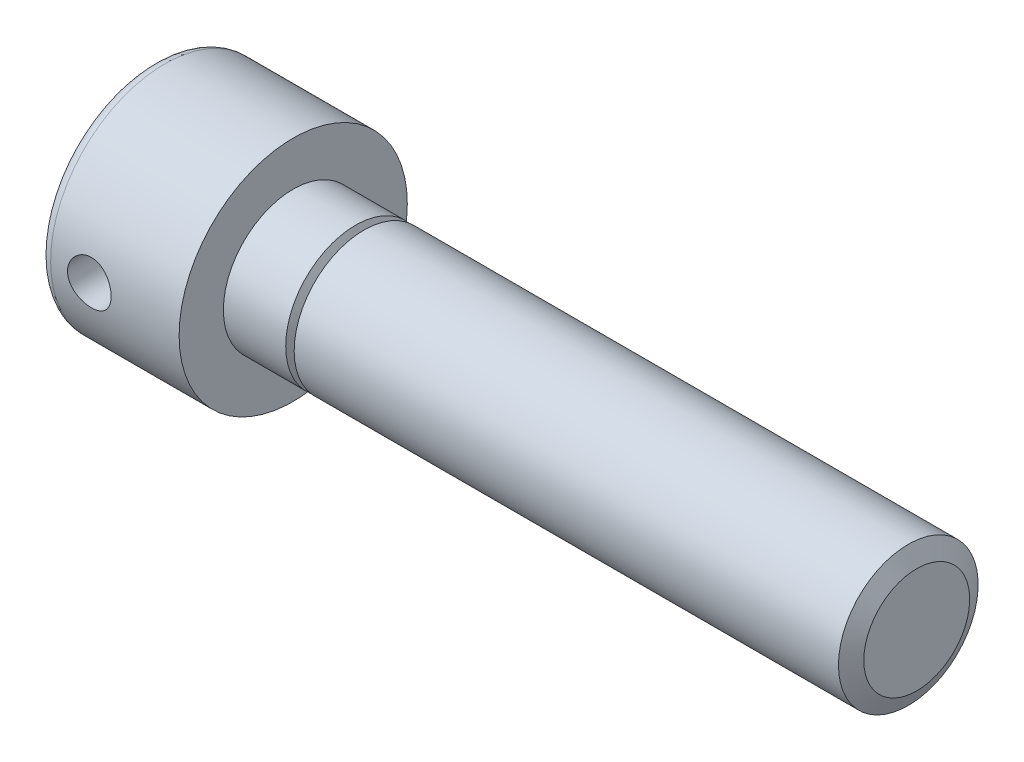
ISO-10303-21;
HEADER;
FILE_DESCRIPTION(('STEP AP214'),'2;1');
FILE_NAME('part.step','',(''),(''),'','','');
FILE_SCHEMA(('AUTOMOTIVE_DESIGN { 1 0 10303 214 1 1 1 1 }'));
ENDSEC;
DATA;
#1=APPLICATION_CONTEXT('core data for automotive mechanical design processes');
#2=APPLICATION_PROTOCOL_DEFINITION('international standard','automotive_design',2000,#1);
#3=PRODUCT_CONTEXT('',#1,'mechanical');
#4=PRODUCT('Part','Part','',(#3));
#5=PRODUCT_RELATED_PRODUCT_CATEGORY('part','',(#4));
#6=PRODUCT_DEFINITION_FORMATION('','',#4);
#7=PRODUCT_DEFINITION_CONTEXT('part definition',#1,'design');
#8=PRODUCT_DEFINITION('design','',#6,#7);
#9=PRODUCT_DEFINITION_SHAPE('','',#8);
#10=(LENGTH_UNIT() NAMED_UNIT(*) SI_UNIT(.MILLI.,.METRE.));
#11=(NAMED_UNIT(*) PLANE_ANGLE_UNIT() SI_UNIT($,.RADIAN.));
#12=(NAMED_UNIT(*) SI_UNIT($,.STERADIAN.) SOLID_ANGLE_UNIT());
#13=UNCERTAINTY_MEASURE_WITH_UNIT(LENGTH_MEASURE(1.E-05),#10,'distance_accuracy_value','');
#14=(GEOMETRIC_REPRESENTATION_CONTEXT(3) GLOBAL_UNCERTAINTY_ASSIGNED_CONTEXT((#13)) GLOBAL_UNIT_ASSIGNED_CONTEXT((#10,
#11,#12)) REPRESENTATION_CONTEXT('',''));
#15=CARTESIAN_POINT('',(0.,0.,0.));
#16=DIRECTION('',(0.,0.,1.));
#17=DIRECTION('',(1.,0.,0.));
#18=AXIS2_PLACEMENT_3D('',#15,#16,#17);
#19=CARTESIAN_POINT('',(-2.8448,0.,0.));
#20=DIRECTION('',(-1.,0.,0.));
#21=DIRECTION('',(0.,0.,1.));
#22=AXIS2_PLACEMENT_3D('',#19,#20,#21);
#23=PLANE('',#22);
#24=CARTESIAN_POINT('',(-2.8448,0.,0.));
#25=DIRECTION('',(-1.,0.,0.));
#26=DIRECTION('',(0.,0.,1.));
#27=AXIS2_PLACEMENT_3D('',#24,#25,#26);
#28=CIRCLE('',#27,2.0955);
#29=CARTESIAN_POINT('',(-2.8448,0.,2.0955));
#30=VERTEX_POINT('',#29);
#31=EDGE_CURVE('E107',#30,#30,#28,.T.);
#32=ORIENTED_EDGE('',*,*,#31,.T.);
#33=EDGE_LOOP('',(#32));
#34=FACE_BOUND('',#33,.T.);
#35=DIRECTION('',(0.,-1.,0.));
#36=VECTOR('',#35,1.);
#37=CARTESIAN_POINT('',(-2.8448,0.,1.1938));
#38=LINE('',#37,#36);
#39=CARTESIAN_POINT('',(-2.8448,0.689240751358576,1.1938));
#40=VERTEX_POINT('',#39);
#41=CARTESIAN_POINT('',(-2.8448,-0.689240751358574,1.1938));
#42=VERTEX_POINT('',#41);
#43=EDGE_CURVE('E135',#40,#42,#38,.T.);
#44=ORIENTED_EDGE('',*,*,#43,.T.);
#45=DIRECTION('',(0.,-0.5,-0.866025403784439));
#46=VECTOR('',#45,1.);
#47=CARTESIAN_POINT('',(-2.8448,-1.03386112703786,0.5969));
#48=LINE('',#47,#46);
#49=CARTESIAN_POINT('',(-2.8448,-1.37848150271715,0.));
#50=VERTEX_POINT('',#49);
#51=EDGE_CURVE('E9',#42,#50,#48,.T.);
#52=ORIENTED_EDGE('',*,*,#51,.T.);
#53=DIRECTION('',(0.,0.5,-0.866025403784439));
#54=VECTOR('',#53,1.);
#55=CARTESIAN_POINT('',(-2.8448,-1.03386112703786,-0.5969));
#56=LINE('',#55,#54);
#57=CARTESIAN_POINT('',(-2.8448,-0.689240751358576,-1.1938));
#58=VERTEX_POINT('',#57);
#59=EDGE_CURVE('E25',#50,#58,#56,.T.);
#60=ORIENTED_EDGE('',*,*,#59,.T.);
#61=DIRECTION('',(0.,1.,0.));
#62=VECTOR('',#61,1.);
#63=CARTESIAN_POINT('',(-2.8448,0.,-1.1938));
#64=LINE('',#63,#62);
#65=CARTESIAN_POINT('',(-2.8448,0.689240751358575,-1.1938));
#66=VERTEX_POINT('',#65);
#67=EDGE_CURVE('E147',#58,#66,#64,.T.);
#68=ORIENTED_EDGE('',*,*,#67,.T.);
#69=DIRECTION('',(0.,0.5,0.866025403784439));
#70=VECTOR('',#69,1.);
#71=CARTESIAN_POINT('',(-2.8448,1.03386112703786,-0.5969));
#72=LINE('',#71,#70);
#73=CARTESIAN_POINT('',(-2.8448,1.37848150271715,0.));
#74=VERTEX_POINT('',#73);
#75=EDGE_CURVE('E143',#66,#74,#72,.T.);
#76=ORIENTED_EDGE('',*,*,#75,.T.);
#77=DIRECTION('',(0.,-0.5,0.866025403784439));
#78=VECTOR('',#77,1.);
#79=CARTESIAN_POINT('',(-2.8448,1.03386112703786,0.5969));
#80=LINE('',#79,#78);
#81=EDGE_CURVE('E139',#74,#40,#80,.T.);
#82=ORIENTED_EDGE('',*,*,#81,.T.);
#83=EDGE_LOOP('',(#44,#52,#60,#68,#76,#82));
#84=FACE_BOUND('',#83,.T.);
#85=ADVANCED_FACE('F15',(#34,#84),#23,.T.);
#86=CARTESIAN_POINT('',(0.,-2.3241,0.));
#87=DIRECTION('',(1.,0.,0.));
#88=DIRECTION('',(0.,0.,-1.));
#89=AXIS2_PLACEMENT_3D('',#86,#87,#88);
#90=PLANE('',#89);
#91=CARTESIAN_POINT('',(0.,0.,0.));
#92=DIRECTION('',(-1.,0.,0.));
#93=DIRECTION('',(0.,0.,1.));
#94=AXIS2_PLACEMENT_3D('',#91,#92,#93);
#95=CIRCLE('',#94,1.4224);
#96=CARTESIAN_POINT('',(0.,0.,1.4224));
#97=VERTEX_POINT('',#96);
#98=EDGE_CURVE('E131',#97,#97,#95,.T.);
#99=ORIENTED_EDGE('',*,*,#98,.T.);
#100=EDGE_LOOP('',(#99));
#101=FACE_BOUND('',#100,.T.);
#102=CARTESIAN_POINT('',(0.,0.,0.));
#103=DIRECTION('',(-1.,0.,0.));
#104=DIRECTION('',(0.,0.,1.));
#105=AXIS2_PLACEMENT_3D('',#102,#103,#104);
#106=CIRCLE('',#105,2.3241);
#107=CARTESIAN_POINT('',(0.,0.,2.3241));
#108=VERTEX_POINT('',#107);
#109=EDGE_CURVE('E89',#108,#108,#106,.T.);
#110=ORIENTED_EDGE('',*,*,#109,.F.);
#111=EDGE_LOOP('',(#110));
#112=FACE_BOUND('',#111,.T.);
#113=ADVANCED_FACE('F17',(#101,#112),#90,.T.);
#114=CARTESIAN_POINT('',(-2.8448,0.,0.));
#115=DIRECTION('',(-1.,0.,0.));
#116=DIRECTION('',(0.,0.,1.));
#117=AXIS2_PLACEMENT_3D('',#114,#115,#116);
#118=CYLINDRICAL_SURFACE('',#117,1.4224);
#119=CARTESIAN_POINT('',(1.27,0.,0.));
#120=DIRECTION('',(-1.,0.,0.));
#121=DIRECTION('',(0.,0.,1.));
#122=AXIS2_PLACEMENT_3D('',#119,#120,#121);
#123=CIRCLE('',#122,1.4224);
#124=CARTESIAN_POINT('',(1.27,0.,1.4224));
#125=VERTEX_POINT('',#124);
#126=EDGE_CURVE('E127',#125,#125,#123,.T.);
#127=ORIENTED_EDGE('',*,*,#126,.T.);
#128=EDGE_LOOP('',(#127));
#129=FACE_BOUND('',#128,.T.);
#130=ORIENTED_EDGE('',*,*,#98,.F.);
#131=EDGE_LOOP('',(#130));
#132=FACE_BOUND('',#131,.T.);
#133=ADVANCED_FACE('F331',(#129,#132),#118,.T.);
#134=CARTESIAN_POINT('',(1.27,0.,0.));
#135=DIRECTION('',(-1.,0.,0.));
#136=DIRECTION('',(0.,0.,1.));
#137=AXIS2_PLACEMENT_3D('',#134,#135,#136);
#138=CONICAL_SURFACE('',#137,1.4224,1.10714871779409);
#139=CARTESIAN_POINT('',(1.442085,0.,0.));
#140=DIRECTION('',(-1.,0.,0.));
#141=DIRECTION('',(0.,0.,1.));
#142=AXIS2_PLACEMENT_3D('',#139,#140,#141);
#143=CIRCLE('',#142,1.07823);
#144=CARTESIAN_POINT('',(1.442085,0.,1.07823));
#145=VERTEX_POINT('',#144);
#146=EDGE_CURVE('E123',#145,#145,#143,.T.);
#147=ORIENTED_EDGE('',*,*,#146,.T.);
#148=EDGE_LOOP('',(#147));
#149=FACE_BOUND('',#148,.T.);
#150=ORIENTED_EDGE('',*,*,#126,.F.);
#151=EDGE_LOOP('',(#150));
#152=FACE_BOUND('',#151,.T.);
#153=ADVANCED_FACE('F322',(#149,#152),#138,.T.);
#154=CARTESIAN_POINT('',(1.442085,-1.07823,0.));
#155=DIRECTION('',(-1.,0.,0.));
#156=DIRECTION('',(0.,0.,1.));
#157=AXIS2_PLACEMENT_3D('',#154,#155,#156);
#158=PLANE('',#157);
#159=CARTESIAN_POINT('',(1.442085,0.,0.));
#160=DIRECTION('',(-1.,0.,0.));
#161=DIRECTION('',(0.,0.,1.));
#162=AXIS2_PLACEMENT_3D('',#159,#160,#161);
#163=CIRCLE('',#162,1.4224);
#164=CARTESIAN_POINT('',(1.442085,0.,1.4224));
#165=VERTEX_POINT('',#164);
#166=EDGE_CURVE('E119',#165,#165,#163,.T.);
#167=ORIENTED_EDGE('',*,*,#166,.T.);
#168=EDGE_LOOP('',(#167));
#169=FACE_BOUND('',#168,.T.);
#170=ORIENTED_EDGE('',*,*,#146,.F.);
#171=EDGE_LOOP('',(#170));
#172=FACE_BOUND('',#171,.T.);
#173=ADVANCED_FACE('F313',(#169,#172),#158,.T.);
#174=CARTESIAN_POINT('',(-2.8448,0.,0.));
#175=DIRECTION('',(-1.,0.,0.));
#176=DIRECTION('',(0.,0.,1.));
#177=AXIS2_PLACEMENT_3D('',#174,#175,#176);
#178=CYLINDRICAL_SURFACE('',#177,1.4224);
#179=CARTESIAN_POINT('',(12.527915,0.,0.));
#180=DIRECTION('',(-1.,0.,0.));
#181=DIRECTION('',(0.,0.,1.));
#182=AXIS2_PLACEMENT_3D('',#179,#180,#181);
#183=CIRCLE('',#182,1.4224);
#184=CARTESIAN_POINT('',(12.527915,0.,1.4224));
#185=VERTEX_POINT('',#184);
#186=EDGE_CURVE('E115',#185,#185,#183,.T.);
#187=ORIENTED_EDGE('',*,*,#186,.T.);
#188=EDGE_LOOP('',(#187));
#189=FACE_BOUND('',#188,.T.);
#190=ORIENTED_EDGE('',*,*,#166,.F.);
#191=EDGE_LOOP('',(#190));
#192=FACE_BOUND('',#191,.T.);
#193=ADVANCED_FACE('F304',(#189,#192),#178,.T.);
#194=CARTESIAN_POINT('',(12.527915,0.,0.));
#195=DIRECTION('',(-1.,0.,0.));
#196=DIRECTION('',(0.,0.,1.));
#197=AXIS2_PLACEMENT_3D('',#194,#195,#196);
#198=CONICAL_SURFACE('',#197,1.4224,1.10714871779409);
#199=CARTESIAN_POINT('',(12.7,0.,0.));
#200=DIRECTION('',(-1.,0.,0.));
#201=DIRECTION('',(0.,0.,1.));
#202=AXIS2_PLACEMENT_3D('',#199,#200,#201);
#203=CIRCLE('',#202,1.07823);
#204=CARTESIAN_POINT('',(12.7,0.,1.07823));
#205=VERTEX_POINT('',#204);
#206=EDGE_CURVE('E111',#205,#205,#203,.T.);
#207=ORIENTED_EDGE('',*,*,#206,.T.);
#208=EDGE_LOOP('',(#207));
#209=FACE_BOUND('',#208,.T.);
#210=ORIENTED_EDGE('',*,*,#186,.F.);
#211=EDGE_LOOP('',(#210));
#212=FACE_BOUND('',#211,.T.);
#213=ADVANCED_FACE('F295',(#209,#212),#198,.T.);
#214=CARTESIAN_POINT('',(12.7,-1.07823,0.));
#215=DIRECTION('',(1.,0.,0.));
#216=DIRECTION('',(0.,0.,-1.));
#217=AXIS2_PLACEMENT_3D('',#214,#215,#216);
#218=PLANE('',#217);
#219=ORIENTED_EDGE('',*,*,#206,.F.);
#220=EDGE_LOOP('',(#219));
#221=FACE_BOUND('',#220,.T.);
#222=ADVANCED_FACE('F286',(#221),#218,.T.);
#223=CARTESIAN_POINT('',(-2.6162,0.,0.));
#224=DIRECTION('',(-1.,0.,0.));
#225=DIRECTION('',(0.,0.,1.));
#226=AXIS2_PLACEMENT_3D('',#223,#224,#225);
#227=TOROIDAL_SURFACE('',#226,2.0955,0.2286);
#228=CARTESIAN_POINT('',(-2.6162,0.,0.));
#229=DIRECTION('',(-1.,0.,0.));
#230=DIRECTION('',(0.,0.,1.));
#231=AXIS2_PLACEMENT_3D('',#228,#229,#230);
#232=CIRCLE('',#231,2.3241);
#233=CARTESIAN_POINT('',(-2.6162,0.,2.3241));
#234=VERTEX_POINT('',#233);
#235=EDGE_CURVE('E97',#234,#234,#232,.T.);
#236=ORIENTED_EDGE('',*,*,#235,.T.);
#237=EDGE_LOOP('',(#236));
#238=FACE_BOUND('',#237,.T.);
#239=ORIENTED_EDGE('',*,*,#31,.F.);
#240=EDGE_LOOP('',(#239));
#241=FACE_BOUND('',#240,.T.);
#242=ADVANCED_FACE('F277',(#238,#241),#227,.T.);
#243=CARTESIAN_POINT('',(-2.8448,0.,0.));
#244=DIRECTION('',(-1.,0.,0.));
#245=DIRECTION('',(0.,0.,1.));
#246=AXIS2_PLACEMENT_3D('',#243,#244,#245);
#247=CYLINDRICAL_SURFACE('',#246,2.3241);
#248=CARTESIAN_POINT('',(-1.3843,0.,2.3241));
#249=CARTESIAN_POINT('',(-1.38430093486755,0.0247261879495477,2.32409954927227));
#250=CARTESIAN_POINT('',(-1.38637013598345,0.0494644362756174,2.32370133868878));
#251=CARTESIAN_POINT('',(-1.39458657435463,0.0982431939285799,2.32215118785473));
#252=CARTESIAN_POINT('',(-1.4007371939632,0.122283107269652,2.32099862246609));
#253=CARTESIAN_POINT('',(-1.41692073872026,0.168952749541908,2.31806862384384));
#254=CARTESIAN_POINT('',(-1.42695009499309,0.191583752670709,2.3162917651677));
#255=CARTESIAN_POINT('',(-1.4505961447561,0.234839899460193,2.31230695462025));
#256=CARTESIAN_POINT('',(-1.4642125705651,0.255465192637639,2.3100990349196));
#257=CARTESIAN_POINT('',(-1.49482594497226,0.294382901657181,2.30546489302863));
#258=CARTESIAN_POINT('',(-1.51185886499462,0.312646767664744,2.30303651282998));
#259=CARTESIAN_POINT('',(-1.54874436154108,0.346076127399492,2.29825106653114));
#260=CARTESIAN_POINT('',(-1.56859714550529,0.361241392981306,2.29589400569295));
#261=CARTESIAN_POINT('',(-1.61076164696033,0.38816262889297,2.29149706938861));
#262=CARTESIAN_POINT('',(-1.63309232063012,0.399889403933258,2.28945997467282));
#263=CARTESIAN_POINT('',(-1.67945233301084,0.419413841498859,2.28596409669431));
#264=CARTESIAN_POINT('',(-1.70348151878521,0.427211857262929,2.28450526144221));
#265=CARTESIAN_POINT('',(-1.75225047164336,0.438565480530308,2.28235283117447));
#266=CARTESIAN_POINT('',(-1.77697822194572,0.442170967230972,2.28165024656355));
#267=CARTESIAN_POINT('',(-1.82669688673606,0.445192039727115,2.28106277705459));
#268=CARTESIAN_POINT('',(-1.85168777643841,0.444608016677317,2.28117781581889));
#269=CARTESIAN_POINT('',(-1.90086090873464,0.439307058879672,2.28220441551788));
#270=CARTESIAN_POINT('',(-1.92504954290731,0.434646977717875,2.28310501878429));
#271=CARTESIAN_POINT('',(-1.97229521831367,0.421415782524894,2.28558404828694));
#272=CARTESIAN_POINT('',(-1.99535220965258,0.412844496217665,2.28716250438025));
#273=CARTESIAN_POINT('',(-2.03984570904388,0.391978984865874,2.29083076794129));
#274=CARTESIAN_POINT('',(-2.06127124182469,0.379661927495011,2.29292369593332));
#275=CARTESIAN_POINT('',(-2.10177278686305,0.351670646572467,2.29738303742556));
#276=CARTESIAN_POINT('',(-2.12084855102172,0.335996068996811,2.29974947975355));
#277=CARTESIAN_POINT('',(-2.1564374282417,0.301428787528978,2.3045368764569));
#278=CARTESIAN_POINT('',(-2.17290333992632,0.282487485499089,2.3069580880374));
#279=CARTESIAN_POINT('',(-2.20243122500809,0.242086717353646,2.31154655587894));
#280=CARTESIAN_POINT('',(-2.2154931616036,0.220627224016625,2.3137138093942));
#281=CARTESIAN_POINT('',(-2.23784979145357,0.175749053688258,2.31755481655435));
#282=CARTESIAN_POINT('',(-2.2471394324729,0.15232779958947,2.31922790755564));
#283=CARTESIAN_POINT('',(-2.26163928550405,0.104218083439616,2.32188698545675));
#284=CARTESIAN_POINT('',(-2.26684994870836,0.0795297618660925,2.32287304835025));
#285=CARTESIAN_POINT('',(-2.27297790380763,0.029992672999654,2.32403648635956));
#286=CARTESIAN_POINT('',(-2.2739598459049,0.00515218005277357,2.32422603773));
#287=CARTESIAN_POINT('',(-2.27177610674673,-0.0443380143980917,2.32380878468609));
#288=CARTESIAN_POINT('',(-2.26861063787157,-0.0689877256065943,2.32320202104937));
#289=CARTESIAN_POINT('',(-2.25827567218944,-0.117190549281871,2.32126790795945));
#290=CARTESIAN_POINT('',(-2.25113902344653,-0.140750962585753,2.31994647248002));
#291=CARTESIAN_POINT('',(-2.23309993021651,-0.186340829275227,2.31673059195665));
#292=CARTESIAN_POINT('',(-2.22219722206942,-0.208370175341808,2.31483610679494));
#293=CARTESIAN_POINT('',(-2.19679335902694,-0.250547529840524,2.31065390498313));
#294=CARTESIAN_POINT('',(-2.18225287117741,-0.270671421736224,2.30836198017262));
#295=CARTESIAN_POINT('',(-2.15003925912195,-0.308216762055864,2.3036496970659));
#296=CARTESIAN_POINT('',(-2.13236582971735,-0.325637946882538,2.30122932627309));
#297=CARTESIAN_POINT('',(-2.09409484726977,-0.357530147315511,2.29649235541527));
#298=CARTESIAN_POINT('',(-2.07346018738169,-0.371956964272113,2.29417765670866));
#299=CARTESIAN_POINT('',(-2.03002235702591,-0.397139750451742,2.28995295704193));
#300=CARTESIAN_POINT('',(-2.00721926914042,-0.407895859398122,2.28804294067885));
#301=CARTESIAN_POINT('',(-1.96020190253759,-0.425369919362874,2.28485891465019));
#302=CARTESIAN_POINT('',(-1.93599525052019,-0.432107793871279,2.28358177244993));
#303=CARTESIAN_POINT('',(-1.88676661677932,-0.441415278307372,2.28180109037161));
#304=CARTESIAN_POINT('',(-1.8617447315702,-0.44398537983599,2.28129745925605));
#305=CARTESIAN_POINT('',(-1.81203893484044,-0.444867396478518,2.28112557959062));
#306=CARTESIAN_POINT('',(-1.78735628160574,-0.443249065240748,2.2814436464224));
#307=CARTESIAN_POINT('',(-1.73862183588461,-0.435953232325106,2.28284891227715));
#308=CARTESIAN_POINT('',(-1.71457003926228,-0.430275757265919,2.28393610625641));
#309=CARTESIAN_POINT('',(-1.66781959103379,-0.415052731833659,2.28675125866519));
#310=CARTESIAN_POINT('',(-1.64511830045289,-0.405515029796836,2.28847791638139));
#311=CARTESIAN_POINT('',(-1.60162705730831,-0.382850027121169,2.29237831119011));
#312=CARTESIAN_POINT('',(-1.58083724744251,-0.369722458778077,2.29455208162181));
#313=CARTESIAN_POINT('',(-1.54141031028048,-0.340009115621822,2.29914407362241));
#314=CARTESIAN_POINT('',(-1.52281173035208,-0.323372689729811,2.30156557369649));
#315=CARTESIAN_POINT('',(-1.4886469940221,-0.287219196844063,2.30635595208282));
#316=CARTESIAN_POINT('',(-1.47308153511208,-0.2677014690802,2.30872481818074));
#317=CARTESIAN_POINT('',(-1.44528737020985,-0.226118787324831,2.31316925511882));
#318=CARTESIAN_POINT('',(-1.43309149866759,-0.204031557778585,2.31524185095666));
#319=CARTESIAN_POINT('',(-1.41260335729292,-0.158088641605201,2.31883110976247));
#320=CARTESIAN_POINT('',(-1.40430746424033,-0.134234620340482,2.32034828844174));
#321=CARTESIAN_POINT('',(-1.3935164122464,-0.0919293624376869,2.32235072183206));
#322=CARTESIAN_POINT('',(-1.39006623879096,-0.0737235998588962,2.32300295726612));
#323=CARTESIAN_POINT('',(-1.38545771393589,-0.0370141390929853,2.32387775921255));
#324=CARTESIAN_POINT('',(-1.38429930014209,-0.0185104490308996,2.32410033742252));
#325=CARTESIAN_POINT('',(-1.3843,0.,2.3241));
#326=B_SPLINE_CURVE_WITH_KNOTS('',3,(#248,#249,#250,#251,#252,#253,#254,#255,#256,#257,#258,
#259,#260,#261,#262,#263,#264,#265,#266,#267,#268,#269,#270,#271,#272,#273,#274,#275,#276,#277,
#278,#279,#280,#281,#282,#283,#284,#285,#286,#287,#288,#289,#290,#291,#292,#293,#294,#295,#296,
#297,#298,#299,#300,#301,#302,#303,#304,#305,#306,#307,#308,#309,#310,#311,#312,#313,#314,#315,
#316,#317,#318,#319,#320,#321,#322,#323,#324,#325),.UNSPECIFIED.,.T.,.F.,(4,2,2,2,2,2,2,2,2,2,2,
2,2,2,2,2,2,2,2,2,2,2,2,2,2,2,2,2,2,2,2,2,2,2,2,2,2,2,4),(0.,0.0741108632781098,
0.148283220543787,0.222387492616689,0.296486236303981,0.37141049281206,0.446340263896097,
0.521888951226711,0.597430844684972,0.67206449896909,0.746691185152356,0.820293271890112,
0.893898600876763,0.967961902711264,1.04203301778332,1.11731990456458,1.19260760526664,
1.26799580883056,1.34337567221679,1.41759891604649,1.49181835920695,1.56543282280502,
1.63905244116058,1.7135053377422,1.78796549121781,1.86345685341259,1.93894534175222,
2.01405635686173,2.08915851176427,2.16301800278419,2.23687700945949,2.3105865996555,
2.38430168803786,2.45916426057073,2.53404402811505,2.60962959654975,2.68514480382047,
2.74062697965054,2.79610764493322),.UNSPECIFIED.);
#327=CARTESIAN_POINT('',(-1.3843,0.,2.3241));
#328=VERTEX_POINT('',#327);
#329=EDGE_CURVE('E85',#328,#328,#326,.T.);
#330=ORIENTED_EDGE('',*,*,#329,.F.);
#331=EDGE_LOOP('',(#330));
#332=FACE_BOUND('',#331,.T.);
#333=CARTESIAN_POINT('',(-1.8288,0.4445,-2.28119717692268));
#334=CARTESIAN_POINT('',(-1.80407847435277,0.444499061456731,-2.28119765992554));
#335=CARTESIAN_POINT('',(-1.77934487818359,0.442430614204679,-2.28160340664396));
#336=CARTESIAN_POINT('',(-1.73057578093452,0.434217441531706,-2.28318042519759));
#337=CARTESIAN_POINT('',(-1.70654087962683,0.428069315965336,-2.28435233556813));
#338=CARTESIAN_POINT('',(-1.65988185034576,0.411893063069742,-2.2873242105894));
#339=CARTESIAN_POINT('',(-1.63725640571407,0.401868621917639,-2.28912357840113));
#340=CARTESIAN_POINT('',(-1.59400962447655,0.378234157314159,-2.29314691710774));
#341=CARTESIAN_POINT('',(-1.57338814478289,0.364624390121407,-2.29537085765345));
#342=CARTESIAN_POINT('',(-1.53446634577937,0.334017832605717,-2.30002491433144));
#343=CARTESIAN_POINT('',(-1.51619573404061,0.316983576153708,-2.30245712324928));
#344=CARTESIAN_POINT('',(-1.48275329318448,0.280092546354547,-2.30723520315865));
#345=CARTESIAN_POINT('',(-1.46758167149086,0.260235584226849,-2.30958106836236));
#346=CARTESIAN_POINT('',(-1.44065361338266,0.218067208125288,-2.31394460970543));
#347=CARTESIAN_POINT('',(-1.42892525208332,0.195737556446755,-2.31595953192487));
#348=CARTESIAN_POINT('',(-1.40939760276585,0.149379756155845,-2.31941071011618));
#349=CARTESIAN_POINT('',(-1.40159797860103,0.125351753056785,-2.32084701559298));
#350=CARTESIAN_POINT('',(-1.39024125150589,0.0765873019574365,-2.32296434491799));
#351=CARTESIAN_POINT('',(-1.38663404273973,0.0518629164953577,-2.32365428196922));
#352=CARTESIAN_POINT('',(-1.38360835906374,0.00215090527482322,-2.32423187703968));
#353=CARTESIAN_POINT('',(-1.3841895136556,-0.0228366970044901,-2.32411960602143));
#354=CARTESIAN_POINT('',(-1.38948575691685,-0.0720220137891947,-2.32311238297186));
#355=CARTESIAN_POINT('',(-1.39414688805173,-0.0962257779041499,-2.32222764714361));
#356=CARTESIAN_POINT('',(-1.40738536136785,-0.143501163472998,-2.31978638059016));
#357=CARTESIAN_POINT('',(-1.41596285048901,-0.166572742411853,-2.31822982465871));
#358=CARTESIAN_POINT('',(-1.43684154780038,-0.211084589786303,-2.31460280802933));
#359=CARTESIAN_POINT('',(-1.44916419866126,-0.232514550430192,-2.3125294007619));
#360=CARTESIAN_POINT('',(-1.4771676054672,-0.27302261510326,-2.30809776603714));
#361=CARTESIAN_POINT('',(-1.49284871618202,-0.292100470332859,-2.30573950850123));
#362=CARTESIAN_POINT('',(-1.52742086017188,-0.327682623188537,-2.30095477885545));
#363=CARTESIAN_POINT('',(-1.5463591044487,-0.344141016708504,-2.29852781867505));
#364=CARTESIAN_POINT('',(-1.58675099933989,-0.373655158241008,-2.29391509241437));
#365=CARTESIAN_POINT('',(-1.60820468976425,-0.386710852391169,-2.29172933015242));
#366=CARTESIAN_POINT('',(-1.65308083493203,-0.409062883285504,-2.28784569427726));
#367=CARTESIAN_POINT('',(-1.67650680621981,-0.41835232578002,-2.28614871703031));
#368=CARTESIAN_POINT('',(-1.72462684015902,-0.432850358368082,-2.28344833652028));
#369=CARTESIAN_POINT('',(-1.74932075246107,-0.438059431116701,-2.28244485122769));
#370=CARTESIAN_POINT('',(-1.79886113970388,-0.444181370311988,-2.28126136269168));
#371=CARTESIAN_POINT('',(-1.82369915875335,-0.44516028668656,-2.28106870046015));
#372=CARTESIAN_POINT('',(-1.87318369717404,-0.442971379923753,-2.28149476590875));
#373=CARTESIAN_POINT('',(-1.89783022635542,-0.439803770643802,-2.28211345174352));
#374=CARTESIAN_POINT('',(-1.94601358793605,-0.429468502798602,-2.28408069265384));
#375=CARTESIAN_POINT('',(-1.96955817237807,-0.422335665532918,-2.28542289101573));
#376=CARTESIAN_POINT('',(-2.0151180527066,-0.404309447561266,-2.2886804197637));
#377=CARTESIAN_POINT('',(-2.03713323177615,-0.393415779979196,-2.29059579387013));
#378=CARTESIAN_POINT('',(-2.07929977460578,-0.368025851716685,-2.29481257292222));
#379=CARTESIAN_POINT('',(-2.09942564115157,-0.353487982747343,-2.29711832891348));
#380=CARTESIAN_POINT('',(-2.13697617050639,-0.321278245543313,-2.30184392112678));
#381=CARTESIAN_POINT('',(-2.15440057986501,-0.303606083582659,-2.30426376802507));
#382=CARTESIAN_POINT('',(-2.1863014180781,-0.265333962988759,-2.30898568485609));
#383=CARTESIAN_POINT('',(-2.20073335537505,-0.244696617375236,-2.31128564216542));
#384=CARTESIAN_POINT('',(-2.22592511448342,-0.201251888560079,-2.31547274468481));
#385=CARTESIAN_POINT('',(-2.23668508160829,-0.178444591277141,-2.31735990622968));
#386=CARTESIAN_POINT('',(-2.25416137597155,-0.131428544249365,-2.32049971880432));
#387=CARTESIAN_POINT('',(-2.26089928004312,-0.107228050463611,-2.32175574975188));
#388=CARTESIAN_POINT('',(-2.27020890392427,-0.0580125395120532,-2.32350622214802));
#389=CARTESIAN_POINT('',(-2.27278108067732,-0.0329976119895404,-2.32400074712679));
#390=CARTESIAN_POINT('',(-2.273669799336,0.0167105156329233,-2.32417073463421));
#391=CARTESIAN_POINT('',(-2.27205344774595,0.0414024966996732,-2.32385911297723));
#392=CARTESIAN_POINT('',(-2.26475831800239,0.090156125100985,-2.32247875345601));
#393=CARTESIAN_POINT('',(-2.25907958224134,0.114217779010522,-2.32141002349249));
#394=CARTESIAN_POINT('',(-2.2438496228376,0.160990391092384,-2.31863563395371));
#395=CARTESIAN_POINT('',(-2.23430581420234,0.183703840615695,-2.31693119445713));
#396=CARTESIAN_POINT('',(-2.2116247921413,0.227216900062015,-2.31306960307557));
#397=CARTESIAN_POINT('',(-2.19848732502293,0.248016374730301,-2.31091241923182));
#398=CARTESIAN_POINT('',(-2.16876227869123,0.287444709207981,-2.30634269283359));
#399=CARTESIAN_POINT('',(-2.15212635483327,0.30603674172063,-2.30392683343554));
#400=CARTESIAN_POINT('',(-2.11597666380038,0.340188500946385,-2.29913260308203));
#401=CARTESIAN_POINT('',(-2.09646221952076,0.355747512207564,-2.29675424109307));
#402=CARTESIAN_POINT('',(-2.05488296259398,0.383533730175263,-2.29227904649457));
#403=CARTESIAN_POINT('',(-2.03279526550165,0.395727184566284,-2.2901851657826));
#404=CARTESIAN_POINT('',(-1.98685155766996,0.416210682251051,-2.28655167867123));
#405=CARTESIAN_POINT('',(-1.96299722123901,0.424504368060152,-2.28501155536151));
#406=CARTESIAN_POINT('',(-1.92069765529225,0.435289985884959,-2.28297708482509));
#407=CARTESIAN_POINT('',(-1.90249825524282,0.438737746016125,-2.28231363362375));
#408=CARTESIAN_POINT('',(-1.8658014851711,0.443343070844551,-2.28142350529326));
#409=CARTESIAN_POINT('',(-1.84730412387673,0.444500702501988,-2.28119681539383));
#410=CARTESIAN_POINT('',(-1.8288,0.4445,-2.28119717692268));
#411=B_SPLINE_CURVE_WITH_KNOTS('',3,(#333,#334,#335,#336,#337,#338,#339,#340,#341,#342,#343,
#344,#345,#346,#347,#348,#349,#350,#351,#352,#353,#354,#355,#356,#357,#358,#359,#360,#361,#362,
#363,#364,#365,#366,#367,#368,#369,#370,#371,#372,#373,#374,#375,#376,#377,#378,#379,#380,#381,
#382,#383,#384,#385,#386,#387,#388,#389,#390,#391,#392,#393,#394,#395,#396,#397,#398,#399,#400,
#401,#402,#403,#404,#405,#406,#407,#408,#409,#410),.UNSPECIFIED.,.T.,.F.,(4,2,2,2,2,2,2,2,2,2,2,
2,2,2,2,2,2,2,2,2,2,2,2,2,2,2,2,2,2,2,2,2,2,2,2,2,2,2,4),(0.,0.0740968503337658,
0.148255533247728,0.222343867803858,0.29642690838512,0.371369504993112,0.446317116068702,
0.521859853619328,0.597396126559341,0.672020026586024,0.746637325540573,0.820282474308219,
0.89393038643487,0.968008172530782,1.04209378767131,1.1173611244417,1.19262965256954,
1.2680353468385,1.34343212023964,1.41764729016018,1.49185863257755,1.5654283421883,
1.63900366493621,1.71346069940044,1.78792471519391,1.86342699216814,1.93892628089162,
2.01401681730254,2.0890991163873,2.16298594864764,2.23687200988344,2.31061698974445,
2.38436717694105,2.45921273728305,2.53407593145287,2.60966467769837,2.68518268056749,
2.74064598035581,2.79610765845031),.UNSPECIFIED.);
#412=CARTESIAN_POINT('',(-1.8288,0.4445,-2.28119717692268));
#413=VERTEX_POINT('',#412);
#414=EDGE_CURVE('E365',#413,#413,#411,.T.);
#415=ORIENTED_EDGE('',*,*,#414,.F.);
#416=EDGE_LOOP('',(#415));
#417=FACE_BOUND('',#416,.T.);
#418=ORIENTED_EDGE('',*,*,#109,.T.);
#419=EDGE_LOOP('',(#418));
#420=FACE_BOUND('',#419,.T.);
#421=ORIENTED_EDGE('',*,*,#235,.F.);
#422=EDGE_LOOP('',(#421));
#423=FACE_BOUND('',#422,.T.);
#424=ADVANCED_FACE('F269',(#332,#417,#420,#423),#247,.T.);
#425=CARTESIAN_POINT('',(-1.22555,-0.689240751358574,1.1938));
#426=DIRECTION('',(0.,0.866025403784438,-0.5));
#427=DIRECTION('',(0.,0.5,0.866025403784439));
#428=AXIS2_PLACEMENT_3D('',#425,#426,#427);
#429=PLANE('',#428);
#430=DIRECTION('',(-1.,0.,0.));
#431=VECTOR('',#430,1.);
#432=CARTESIAN_POINT('',(-1.22555,-0.689240751358574,1.1938));
#433=LINE('',#432,#431);
#434=CARTESIAN_POINT('',(-1.22555,-0.689240751358574,1.1938));
#435=VERTEX_POINT('',#434);
#436=EDGE_CURVE('E32',#435,#42,#433,.T.);
#437=ORIENTED_EDGE('',*,*,#436,.F.);
#438=DIRECTION('',(0.,-0.5,-0.866025403784439));
#439=VECTOR('',#438,1.);
#440=CARTESIAN_POINT('',(-1.22555,-0.689240751358574,1.1938));
#441=LINE('',#440,#439);
#442=CARTESIAN_POINT('',(-1.22555,-1.37848150271715,0.));
#443=VERTEX_POINT('',#442);
#444=EDGE_CURVE('E75',#435,#443,#441,.T.);
#445=ORIENTED_EDGE('',*,*,#444,.T.);
#446=DIRECTION('',(-1.,0.,0.));
#447=VECTOR('',#446,1.);
#448=CARTESIAN_POINT('',(-1.22555,-1.37848150271715,0.));
#449=LINE('',#448,#447);
#450=EDGE_CURVE('E83',#443,#50,#449,.T.);
#451=ORIENTED_EDGE('',*,*,#450,.T.);
#452=ORIENTED_EDGE('',*,*,#51,.F.);
#453=EDGE_LOOP('',(#437,#445,#451,#452));
#454=FACE_BOUND('',#453,.T.);
#455=ADVANCED_FACE('F82',(#454),#429,.T.);
#456=CARTESIAN_POINT('',(-1.22555,-1.37848150271715,0.));
#457=DIRECTION('',(0.,0.866025403784439,0.5));
#458=DIRECTION('',(0.,-0.5,0.866025403784439));
#459=AXIS2_PLACEMENT_3D('',#456,#457,#458);
#460=PLANE('',#459);
#461=ORIENTED_EDGE('',*,*,#450,.F.);
#462=DIRECTION('',(0.,0.5,-0.866025403784439));
#463=VECTOR('',#462,1.);
#464=CARTESIAN_POINT('',(-1.22555,-1.37848150271715,0.));
#465=LINE('',#464,#463);
#466=CARTESIAN_POINT('',(-1.22555,-0.689240751358576,-1.1938));
#467=VERTEX_POINT('',#466);
#468=EDGE_CURVE('E71',#443,#467,#465,.T.);
#469=ORIENTED_EDGE('',*,*,#468,.T.);
#470=DIRECTION('',(-1.,0.,0.));
#471=VECTOR('',#470,1.);
#472=CARTESIAN_POINT('',(-1.22555,-0.689240751358576,-1.1938));
#473=LINE('',#472,#471);
#474=EDGE_CURVE('E90',#467,#58,#473,.T.);
#475=ORIENTED_EDGE('',*,*,#474,.T.);
#476=ORIENTED_EDGE('',*,*,#59,.F.);
#477=EDGE_LOOP('',(#461,#469,#475,#476));
#478=FACE_BOUND('',#477,.T.);
#479=ADVANCED_FACE('F87',(#478),#460,.T.);
#480=CARTESIAN_POINT('',(-1.22555,-0.689240751358576,-1.1938));
#481=DIRECTION('',(0.,0.,1.));
#482=DIRECTION('',(0.,-1.,0.));
#483=AXIS2_PLACEMENT_3D('',#480,#481,#482);
#484=PLANE('',#483);
#485=CARTESIAN_POINT('',(-1.8288,0.,-1.1938));
#486=DIRECTION('',(0.,0.,1.));
#487=DIRECTION('',(0.,-1.,0.));
#488=AXIS2_PLACEMENT_3D('',#485,#486,#487);
#489=CIRCLE('',#488,0.4445);
#490=CARTESIAN_POINT('',(-1.8288,-0.4445,-1.1938));
#491=VERTEX_POINT('',#490);
#492=EDGE_CURVE('E380',#491,#491,#489,.T.);
#493=ORIENTED_EDGE('',*,*,#492,.F.);
#494=EDGE_LOOP('',(#493));
#495=FACE_BOUND('',#494,.T.);
#496=ORIENTED_EDGE('',*,*,#474,.F.);
#497=DIRECTION('',(0.,1.,0.));
#498=VECTOR('',#497,1.);
#499=CARTESIAN_POINT('',(-1.22555,-0.689240751358576,-1.1938));
#500=LINE('',#499,#498);
#501=CARTESIAN_POINT('',(-1.22555,0.689240751358575,-1.1938));
#502=VERTEX_POINT('',#501);
#503=EDGE_CURVE('E77',#467,#502,#500,.T.);
#504=ORIENTED_EDGE('',*,*,#503,.T.);
#505=DIRECTION('',(-1.,0.,0.));
#506=VECTOR('',#505,1.);
#507=CARTESIAN_POINT('',(-1.22555,0.689240751358575,-1.1938));
#508=LINE('',#507,#506);
#509=EDGE_CURVE('E100',#502,#66,#508,.T.);
#510=ORIENTED_EDGE('',*,*,#509,.T.);
#511=ORIENTED_EDGE('',*,*,#67,.F.);
#512=EDGE_LOOP('',(#496,#504,#510,#511));
#513=FACE_BOUND('',#512,.T.);
#514=ADVANCED_FACE('F182',(#495,#513),#484,.T.);
#515=CARTESIAN_POINT('',(-1.22555,0.689240751358575,-1.1938));
#516=DIRECTION('',(0.,-0.866025403784439,0.5));
#517=DIRECTION('',(0.,-0.5,-0.866025403784439));
#518=AXIS2_PLACEMENT_3D('',#515,#516,#517);
#519=PLANE('',#518);
#520=ORIENTED_EDGE('',*,*,#509,.F.);
#521=DIRECTION('',(0.,0.5,0.866025403784439));
#522=VECTOR('',#521,1.);
#523=CARTESIAN_POINT('',(-1.22555,0.689240751358575,-1.1938));
#524=LINE('',#523,#522);
#525=CARTESIAN_POINT('',(-1.22555,1.37848150271715,0.));
#526=VERTEX_POINT('',#525);
#527=EDGE_CURVE('E185',#502,#526,#524,.T.);
#528=ORIENTED_EDGE('',*,*,#527,.T.);
#529=DIRECTION('',(-1.,0.,0.));
#530=VECTOR('',#529,1.);
#531=CARTESIAN_POINT('',(-1.22555,1.37848150271715,0.));
#532=LINE('',#531,#530);
#533=EDGE_CURVE('E165',#526,#74,#532,.T.);
#534=ORIENTED_EDGE('',*,*,#533,.T.);
#535=ORIENTED_EDGE('',*,*,#75,.F.);
#536=EDGE_LOOP('',(#520,#528,#534,#535));
#537=FACE_BOUND('',#536,.T.);
#538=ADVANCED_FACE('F184',(#537),#519,.T.);
#539=CARTESIAN_POINT('',(-1.22555,1.37848150271715,0.));
#540=DIRECTION('',(0.,-0.866025403784439,-0.5));
#541=DIRECTION('',(0.,0.5,-0.866025403784439));
#542=AXIS2_PLACEMENT_3D('',#539,#540,#541);
#543=PLANE('',#542);
#544=ORIENTED_EDGE('',*,*,#533,.F.);
#545=DIRECTION('',(0.,-0.5,0.866025403784439));
#546=VECTOR('',#545,1.);
#547=CARTESIAN_POINT('',(-1.22555,1.37848150271715,0.));
#548=LINE('',#547,#546);
#549=CARTESIAN_POINT('',(-1.22555,0.689240751358576,1.1938));
#550=VERTEX_POINT('',#549);
#551=EDGE_CURVE('E163',#526,#550,#548,.T.);
#552=ORIENTED_EDGE('',*,*,#551,.T.);
#553=DIRECTION('',(-1.,0.,0.));
#554=VECTOR('',#553,1.);
#555=CARTESIAN_POINT('',(-1.22555,0.689240751358576,1.1938));
#556=LINE('',#555,#554);
#557=EDGE_CURVE('E157',#550,#40,#556,.T.);
#558=ORIENTED_EDGE('',*,*,#557,.T.);
#559=ORIENTED_EDGE('',*,*,#81,.F.);
#560=EDGE_LOOP('',(#544,#552,#558,#559));
#561=FACE_BOUND('',#560,.T.);
#562=ADVANCED_FACE('F160',(#561),#543,.T.);
#563=CARTESIAN_POINT('',(-1.22555,0.689240751358576,1.1938));
#564=DIRECTION('',(0.,0.,-1.));
#565=DIRECTION('',(0.,1.,0.));
#566=AXIS2_PLACEMENT_3D('',#563,#564,#565);
#567=PLANE('',#566);
#568=CARTESIAN_POINT('',(-1.8288,0.,1.1938));
#569=DIRECTION('',(0.,0.,-1.));
#570=DIRECTION('',(0.,1.,0.));
#571=AXIS2_PLACEMENT_3D('',#568,#569,#570);
#572=CIRCLE('',#571,0.4445);
#573=CARTESIAN_POINT('',(-1.8288,0.4445,1.1938));
#574=VERTEX_POINT('',#573);
#575=EDGE_CURVE('E19',#574,#574,#572,.T.);
#576=ORIENTED_EDGE('',*,*,#575,.F.);
#577=EDGE_LOOP('',(#576));
#578=FACE_BOUND('',#577,.T.);
#579=ORIENTED_EDGE('',*,*,#557,.F.);
#580=DIRECTION('',(0.,-1.,0.));
#581=VECTOR('',#580,1.);
#582=CARTESIAN_POINT('',(-1.22555,0.689240751358576,1.1938));
#583=LINE('',#582,#581);
#584=EDGE_CURVE('E173',#550,#435,#583,.T.);
#585=ORIENTED_EDGE('',*,*,#584,.T.);
#586=ORIENTED_EDGE('',*,*,#436,.T.);
#587=ORIENTED_EDGE('',*,*,#43,.F.);
#588=EDGE_LOOP('',(#579,#585,#586,#587));
#589=FACE_BOUND('',#588,.T.);
#590=ADVANCED_FACE('F156',(#578,#589),#567,.T.);
#591=CARTESIAN_POINT('',(-1.22555,-0.689240751358574,1.1938));
#592=DIRECTION('',(-1.,0.,0.));
#593=DIRECTION('',(0.,0.,-1.));
#594=AXIS2_PLACEMENT_3D('',#591,#592,#593);
#595=PLANE('',#594);
#596=ORIENTED_EDGE('',*,*,#444,.F.);
#597=ORIENTED_EDGE('',*,*,#584,.F.);
#598=ORIENTED_EDGE('',*,*,#551,.F.);
#599=ORIENTED_EDGE('',*,*,#527,.F.);
#600=ORIENTED_EDGE('',*,*,#503,.F.);
#601=ORIENTED_EDGE('',*,*,#468,.F.);
#602=EDGE_LOOP('',(#596,#597,#598,#599,#600,#601));
#603=FACE_BOUND('',#602,.T.);
#604=ADVANCED_FACE('F73',(#603),#595,.T.);
#605=CARTESIAN_POINT('',(-1.8288,0.,-2.4241));
#606=DIRECTION('',(0.,0.,1.));
#607=DIRECTION('',(0.,1.,0.));
#608=AXIS2_PLACEMENT_3D('',#605,#606,#607);
#609=CYLINDRICAL_SURFACE('',#608,0.4445);
#610=ORIENTED_EDGE('',*,*,#329,.T.);
#611=EDGE_LOOP('',(#610));
#612=FACE_BOUND('',#611,.T.);
#613=ORIENTED_EDGE('',*,*,#575,.T.);
#614=EDGE_LOOP('',(#613));
#615=FACE_BOUND('',#614,.T.);
#616=ADVANCED_FACE('F203',(#612,#615),#609,.F.);
#617=ORIENTED_EDGE('',*,*,#414,.T.);
#618=EDGE_LOOP('',(#617));
#619=FACE_BOUND('',#618,.T.);
#620=ORIENTED_EDGE('',*,*,#492,.T.);
#621=EDGE_LOOP('',(#620));
#622=FACE_BOUND('',#621,.T.);
#623=ADVANCED_FACE('F213',(#619,#622),#609,.F.);
#624=CLOSED_SHELL('',(#85,#113,#133,#153,#173,#193,#213,#222,#242,#424,#455,#479,#514,#538,#562,
#590,#604,#616,#623));
#625=MANIFOLD_SOLID_BREP('B1',#624);
#626=ADVANCED_BREP_SHAPE_REPRESENTATION('',(#18,#625),#14);
#627=SHAPE_DEFINITION_REPRESENTATION(#9,#626);
ENDSEC;
END-ISO-10303-21;
